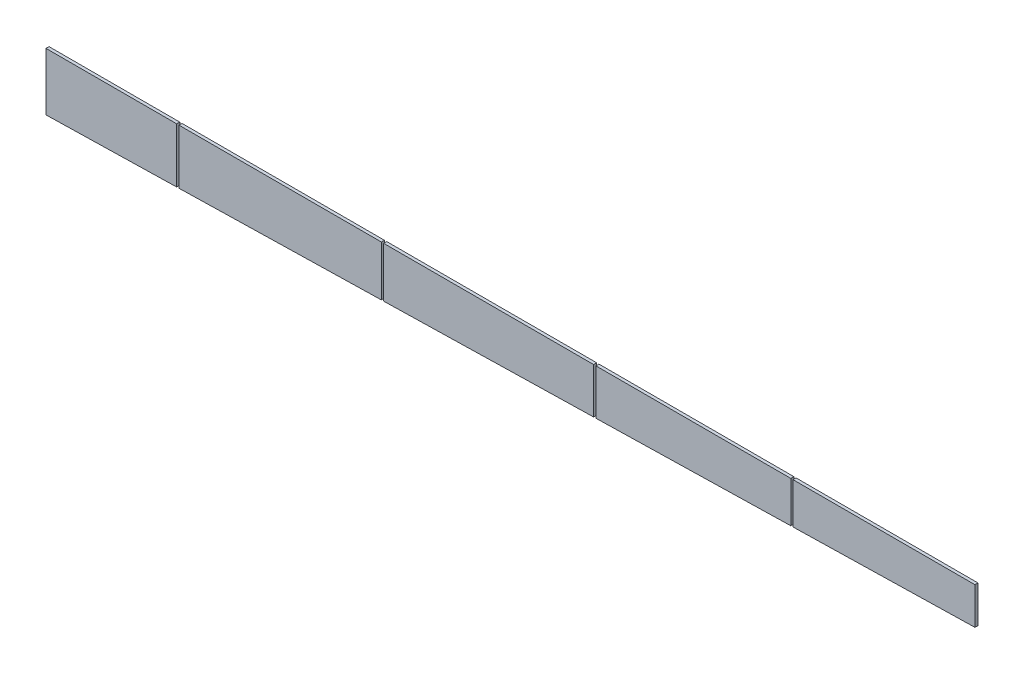
ISO-10303-21;
HEADER;
FILE_DESCRIPTION(('STEP AP214'),'2;1');
FILE_NAME('part.step','',(''),(''),'','','');
FILE_SCHEMA(('AUTOMOTIVE_DESIGN { 1 0 10303 214 1 1 1 1 }'));
ENDSEC;
DATA;
#1=APPLICATION_CONTEXT('core data for automotive mechanical design processes');
#2=APPLICATION_PROTOCOL_DEFINITION('international standard','automotive_design',2000,#1);
#3=PRODUCT_CONTEXT('',#1,'mechanical');
#4=PRODUCT('Part','Part','',(#3));
#5=PRODUCT_RELATED_PRODUCT_CATEGORY('part','',(#4));
#6=PRODUCT_DEFINITION_FORMATION('','',#4);
#7=PRODUCT_DEFINITION_CONTEXT('part definition',#1,'design');
#8=PRODUCT_DEFINITION('design','',#6,#7);
#9=PRODUCT_DEFINITION_SHAPE('','',#8);
#10=(LENGTH_UNIT() NAMED_UNIT(*) SI_UNIT(.MILLI.,.METRE.));
#11=(NAMED_UNIT(*) PLANE_ANGLE_UNIT() SI_UNIT($,.RADIAN.));
#12=(NAMED_UNIT(*) SI_UNIT($,.STERADIAN.) SOLID_ANGLE_UNIT());
#13=UNCERTAINTY_MEASURE_WITH_UNIT(LENGTH_MEASURE(1.E-05),#10,'distance_accuracy_value','');
#14=(GEOMETRIC_REPRESENTATION_CONTEXT(3) GLOBAL_UNCERTAINTY_ASSIGNED_CONTEXT((#13)) GLOBAL_UNIT_ASSIGNED_CONTEXT((#10,
#11,#12)) REPRESENTATION_CONTEXT('',''));
#15=CARTESIAN_POINT('',(0.,0.,0.));
#16=DIRECTION('',(0.,0.,1.));
#17=DIRECTION('',(1.,0.,0.));
#18=AXIS2_PLACEMENT_3D('',#15,#16,#17);
#19=CARTESIAN_POINT('',(621.768336890164,42.7521627669532,2.));
#20=DIRECTION('',(3.29392075161203E-09,-1.,0.));
#21=DIRECTION('',(1.,3.29392075161203E-09,0.));
#22=AXIS2_PLACEMENT_3D('',#19,#20,#21);
#23=PLANE('',#22);
#24=DIRECTION('',(-1.,-3.29392075161203E-09,0.));
#25=VECTOR('',#24,1.);
#26=CARTESIAN_POINT('',(621.768336890164,42.7521627669532,0.));
#27=LINE('',#26,#25);
#28=CARTESIAN_POINT('',(621.768336890164,42.7521627669532,0.));
#29=VERTEX_POINT('',#28);
#30=CARTESIAN_POINT('',(501.768336964029,42.7521623716827,0.));
#31=VERTEX_POINT('',#30);
#32=EDGE_CURVE('E12',#29,#31,#27,.T.);
#33=ORIENTED_EDGE('',*,*,#32,.T.);
#34=DIRECTION('',(0.,0.,-1.));
#35=VECTOR('',#34,1.);
#36=CARTESIAN_POINT('',(501.768336964029,42.7521623716827,2.));
#37=LINE('',#36,#35);
#38=CARTESIAN_POINT('',(501.768336964029,42.7521623716827,2.));
#39=VERTEX_POINT('',#38);
#40=EDGE_CURVE('E118',#39,#31,#37,.T.);
#41=ORIENTED_EDGE('',*,*,#40,.F.);
#42=DIRECTION('',(-1.,-3.29392075161203E-09,0.));
#43=VECTOR('',#42,1.);
#44=CARTESIAN_POINT('',(621.768336890164,42.7521627669532,2.));
#45=LINE('',#44,#43);
#46=CARTESIAN_POINT('',(621.768336890164,42.7521627669532,2.));
#47=VERTEX_POINT('',#46);
#48=EDGE_CURVE('E51',#47,#39,#45,.T.);
#49=ORIENTED_EDGE('',*,*,#48,.F.);
#50=DIRECTION('',(0.,0.,-1.));
#51=VECTOR('',#50,1.);
#52=CARTESIAN_POINT('',(621.768336890164,42.7521627669532,2.));
#53=LINE('',#52,#51);
#54=EDGE_CURVE('E106',#47,#29,#53,.T.);
#55=ORIENTED_EDGE('',*,*,#54,.T.);
#56=EDGE_LOOP('',(#33,#41,#49,#55));
#57=FACE_BOUND('',#56,.T.);
#58=ADVANCED_FACE('F47',(#57),#23,.F.);
#59=CARTESIAN_POINT('',(501.768336964029,42.7521623716827,2.));
#60=DIRECTION('',(1.,0.,0.));
#61=DIRECTION('',(0.,0.,-1.));
#62=AXIS2_PLACEMENT_3D('',#59,#60,#61);
#63=PLANE('',#62);
#64=DIRECTION('',(0.,-1.,0.));
#65=VECTOR('',#64,1.);
#66=CARTESIAN_POINT('',(501.768336964029,42.7521623716827,0.));
#67=LINE('',#66,#65);
#68=CARTESIAN_POINT('',(501.768336964029,15.6953244543433,0.));
#69=VERTEX_POINT('',#68);
#70=EDGE_CURVE('E57',#31,#69,#67,.T.);
#71=ORIENTED_EDGE('',*,*,#70,.T.);
#72=DIRECTION('',(0.,0.,-1.));
#73=VECTOR('',#72,1.);
#74=CARTESIAN_POINT('',(501.768336964029,15.6953244543433,2.));
#75=LINE('',#74,#73);
#76=CARTESIAN_POINT('',(501.768336964029,15.6953244543433,2.));
#77=VERTEX_POINT('',#76);
#78=EDGE_CURVE('E102',#77,#69,#75,.T.);
#79=ORIENTED_EDGE('',*,*,#78,.F.);
#80=DIRECTION('',(0.,-1.,0.));
#81=VECTOR('',#80,1.);
#82=CARTESIAN_POINT('',(501.768336964029,42.7521623716827,2.));
#83=LINE('',#82,#81);
#84=EDGE_CURVE('E81',#39,#77,#83,.T.);
#85=ORIENTED_EDGE('',*,*,#84,.F.);
#86=ORIENTED_EDGE('',*,*,#40,.T.);
#87=EDGE_LOOP('',(#71,#79,#85,#86));
#88=FACE_BOUND('',#87,.T.);
#89=ADVANCED_FACE('F121',(#88),#63,.F.);
#90=CARTESIAN_POINT('',(501.768336964029,15.6953244543433,2.));
#91=DIRECTION('',(-0.0222405963999348,0.99975264734422,0.));
#92=DIRECTION('',(-0.99975264734422,-0.0222405963999348,0.));
#93=AXIS2_PLACEMENT_3D('',#90,#91,#92);
#94=PLANE('',#93);
#95=DIRECTION('',(0.999752647344219,0.0222405963999348,0.));
#96=VECTOR('',#95,1.);
#97=CARTESIAN_POINT('',(501.768336964029,15.6953244543433,0.));
#98=LINE('',#97,#96);
#99=CARTESIAN_POINT('',(621.768336632832,18.3648563307688,0.));
#100=VERTEX_POINT('',#99);
#101=EDGE_CURVE('E97',#69,#100,#98,.T.);
#102=ORIENTED_EDGE('',*,*,#101,.T.);
#103=DIRECTION('',(0.,0.,-1.));
#104=VECTOR('',#103,1.);
#105=CARTESIAN_POINT('',(621.768336632832,18.3648563307688,2.));
#106=LINE('',#105,#104);
#107=CARTESIAN_POINT('',(621.768336632832,18.3648563307688,2.));
#108=VERTEX_POINT('',#107);
#109=EDGE_CURVE('E100',#108,#100,#106,.T.);
#110=ORIENTED_EDGE('',*,*,#109,.F.);
#111=DIRECTION('',(0.999752647344219,0.0222405963999348,0.));
#112=VECTOR('',#111,1.);
#113=CARTESIAN_POINT('',(501.768336964029,15.6953244543433,2.));
#114=LINE('',#113,#112);
#115=EDGE_CURVE('E114',#77,#108,#114,.T.);
#116=ORIENTED_EDGE('',*,*,#115,.F.);
#117=ORIENTED_EDGE('',*,*,#78,.T.);
#118=EDGE_LOOP('',(#102,#110,#116,#117));
#119=FACE_BOUND('',#118,.T.);
#120=ADVANCED_FACE('F98',(#119),#94,.F.);
#121=CARTESIAN_POINT('',(621.768336632832,18.3648563307688,2.));
#122=DIRECTION('',(-1.,1.05519028649025E-08,0.));
#123=DIRECTION('',(-1.05519028649025E-08,-1.,0.));
#124=AXIS2_PLACEMENT_3D('',#121,#122,#123);
#125=PLANE('',#124);
#126=DIRECTION('',(1.05519028649025E-08,1.,0.));
#127=VECTOR('',#126,1.);
#128=CARTESIAN_POINT('',(621.768336632832,18.3648563307688,0.));
#129=LINE('',#128,#127);
#130=EDGE_CURVE('E91',#100,#29,#129,.T.);
#131=ORIENTED_EDGE('',*,*,#130,.T.);
#132=ORIENTED_EDGE('',*,*,#54,.F.);
#133=DIRECTION('',(1.05519028649025E-08,1.,0.));
#134=VECTOR('',#133,1.);
#135=CARTESIAN_POINT('',(621.768336632832,18.3648563307688,2.));
#136=LINE('',#135,#134);
#137=EDGE_CURVE('E105',#108,#47,#136,.T.);
#138=ORIENTED_EDGE('',*,*,#137,.F.);
#139=ORIENTED_EDGE('',*,*,#109,.T.);
#140=EDGE_LOOP('',(#131,#132,#138,#139));
#141=FACE_BOUND('',#140,.T.);
#142=ADVANCED_FACE('F104',(#141),#125,.F.);
#143=CARTESIAN_POINT('',(0.,0.,2.));
#144=DIRECTION('',(0.,0.,1.));
#145=DIRECTION('',(1.,0.,0.));
#146=AXIS2_PLACEMENT_3D('',#143,#144,#145);
#147=PLANE('',#146);
#148=ORIENTED_EDGE('',*,*,#48,.T.);
#149=ORIENTED_EDGE('',*,*,#84,.T.);
#150=ORIENTED_EDGE('',*,*,#115,.T.);
#151=ORIENTED_EDGE('',*,*,#137,.T.);
#152=EDGE_LOOP('',(#148,#149,#150,#151));
#153=FACE_BOUND('',#152,.T.);
#154=ADVANCED_FACE('F49',(#153),#147,.T.);
#155=CARTESIAN_POINT('',(0.,0.,0.));
#156=DIRECTION('',(0.,0.,1.));
#157=DIRECTION('',(1.,0.,0.));
#158=AXIS2_PLACEMENT_3D('',#155,#156,#157);
#159=PLANE('',#158);
#160=ORIENTED_EDGE('',*,*,#32,.F.);
#161=ORIENTED_EDGE('',*,*,#130,.F.);
#162=ORIENTED_EDGE('',*,*,#101,.F.);
#163=ORIENTED_EDGE('',*,*,#70,.F.);
#164=EDGE_LOOP('',(#160,#161,#162,#163));
#165=FACE_BOUND('',#164,.T.);
#166=ADVANCED_FACE('F108',(#165),#159,.F.);
#167=CLOSED_SHELL('',(#58,#89,#120,#142,#154,#166));
#168=MANIFOLD_SOLID_BREP('B2',#167);
#169=CARTESIAN_POINT('',(500.268336964029,42.7521623667417,2.));
#170=DIRECTION('',(3.2939208537579E-09,-1.,0.));
#171=DIRECTION('',(1.,3.2939208537579E-09,0.));
#172=AXIS2_PLACEMENT_3D('',#169,#170,#171);
#173=PLANE('',#172);
#174=DIRECTION('',(-1.,-3.2939208537579E-09,0.));
#175=VECTOR('',#174,1.);
#176=CARTESIAN_POINT('',(500.268336964029,42.7521623667417,0.));
#177=LINE('',#176,#175);
#178=CARTESIAN_POINT('',(500.268336964029,42.7521623667417,0.));
#179=VERTEX_POINT('',#178);
#180=CARTESIAN_POINT('',(371.768336964029,42.7521619434729,0.));
#181=VERTEX_POINT('',#180);
#182=EDGE_CURVE('E45',#179,#181,#177,.T.);
#183=ORIENTED_EDGE('',*,*,#182,.T.);
#184=DIRECTION('',(0.,0.,-1.));
#185=VECTOR('',#184,1.);
#186=CARTESIAN_POINT('',(371.768336964029,42.7521619434729,2.));
#187=LINE('',#186,#185);
#188=CARTESIAN_POINT('',(371.768336964029,42.7521619434729,2.));
#189=VERTEX_POINT('',#188);
#190=EDGE_CURVE('E263',#189,#181,#187,.T.);
#191=ORIENTED_EDGE('',*,*,#190,.F.);
#192=DIRECTION('',(-1.,-3.2939208537579E-09,0.));
#193=VECTOR('',#192,1.);
#194=CARTESIAN_POINT('',(500.268336964029,42.7521623667417,2.));
#195=LINE('',#194,#193);
#196=CARTESIAN_POINT('',(500.268336964029,42.7521623667417,2.));
#197=VERTEX_POINT('',#196);
#198=EDGE_CURVE('E196',#197,#189,#195,.T.);
#199=ORIENTED_EDGE('',*,*,#198,.F.);
#200=DIRECTION('',(0.,0.,-1.));
#201=VECTOR('',#200,1.);
#202=CARTESIAN_POINT('',(500.268336964029,42.7521623667417,2.));
#203=LINE('',#202,#201);
#204=EDGE_CURVE('E251',#197,#179,#203,.T.);
#205=ORIENTED_EDGE('',*,*,#204,.T.);
#206=EDGE_LOOP('',(#183,#191,#199,#205));
#207=FACE_BOUND('',#206,.T.);
#208=ADVANCED_FACE('F192',(#207),#173,.F.);
#209=CARTESIAN_POINT('',(371.768336964029,42.7521619434729,2.));
#210=DIRECTION('',(1.,0.,0.));
#211=DIRECTION('',(0.,0.,-1.));
#212=AXIS2_PLACEMENT_3D('',#209,#210,#211);
#213=PLANE('',#212);
#214=DIRECTION('',(0.,-1.,0.));
#215=VECTOR('',#214,1.);
#216=CARTESIAN_POINT('',(371.768336964029,42.7521619434729,0.));
#217=LINE('',#216,#215);
#218=CARTESIAN_POINT('',(371.768336964029,12.8033315802338,0.));
#219=VERTEX_POINT('',#218);
#220=EDGE_CURVE('E202',#181,#219,#217,.T.);
#221=ORIENTED_EDGE('',*,*,#220,.T.);
#222=DIRECTION('',(0.,0.,-1.));
#223=VECTOR('',#222,1.);
#224=CARTESIAN_POINT('',(371.768336964029,12.8033315802338,2.));
#225=LINE('',#224,#223);
#226=CARTESIAN_POINT('',(371.768336964029,12.8033315802338,2.));
#227=VERTEX_POINT('',#226);
#228=EDGE_CURVE('E247',#227,#219,#225,.T.);
#229=ORIENTED_EDGE('',*,*,#228,.F.);
#230=DIRECTION('',(0.,-1.,0.));
#231=VECTOR('',#230,1.);
#232=CARTESIAN_POINT('',(371.768336964029,42.7521619434729,2.));
#233=LINE('',#232,#231);
#234=EDGE_CURVE('E226',#189,#227,#233,.T.);
#235=ORIENTED_EDGE('',*,*,#234,.F.);
#236=ORIENTED_EDGE('',*,*,#190,.T.);
#237=EDGE_LOOP('',(#221,#229,#235,#236));
#238=FACE_BOUND('',#237,.T.);
#239=ADVANCED_FACE('F266',(#238),#213,.F.);
#240=CARTESIAN_POINT('',(371.768336964029,12.8033315802338,2.));
#241=DIRECTION('',(-0.0222405963999345,0.99975264734422,0.));
#242=DIRECTION('',(-0.99975264734422,-0.0222405963999345,0.));
#243=AXIS2_PLACEMENT_3D('',#240,#241,#242);
#244=PLANE('',#243);
#245=DIRECTION('',(0.999752647344219,0.0222405963999345,0.));
#246=VECTOR('',#245,1.);
#247=CARTESIAN_POINT('',(371.768336964029,12.8033315802338,0.));
#248=LINE('',#247,#246);
#249=CARTESIAN_POINT('',(500.268336964029,15.6619553057958,0.));
#250=VERTEX_POINT('',#249);
#251=EDGE_CURVE('E242',#219,#250,#248,.T.);
#252=ORIENTED_EDGE('',*,*,#251,.T.);
#253=DIRECTION('',(0.,0.,-1.));
#254=VECTOR('',#253,1.);
#255=CARTESIAN_POINT('',(500.268336964029,15.6619553057958,2.));
#256=LINE('',#255,#254);
#257=CARTESIAN_POINT('',(500.268336964029,15.6619553057958,2.));
#258=VERTEX_POINT('',#257);
#259=EDGE_CURVE('E245',#258,#250,#256,.T.);
#260=ORIENTED_EDGE('',*,*,#259,.F.);
#261=DIRECTION('',(0.999752647344219,0.0222405963999345,0.));
#262=VECTOR('',#261,1.);
#263=CARTESIAN_POINT('',(371.768336964029,12.8033315802338,2.));
#264=LINE('',#263,#262);
#265=EDGE_CURVE('E259',#227,#258,#264,.T.);
#266=ORIENTED_EDGE('',*,*,#265,.F.);
#267=ORIENTED_EDGE('',*,*,#228,.T.);
#268=EDGE_LOOP('',(#252,#260,#266,#267));
#269=FACE_BOUND('',#268,.T.);
#270=ADVANCED_FACE('F243',(#269),#244,.F.);
#271=CARTESIAN_POINT('',(500.268336964029,15.6619553057958,2.));
#272=DIRECTION('',(-1.,0.,0.));
#273=DIRECTION('',(0.,0.,1.));
#274=AXIS2_PLACEMENT_3D('',#271,#272,#273);
#275=PLANE('',#274);
#276=DIRECTION('',(0.,1.,0.));
#277=VECTOR('',#276,1.);
#278=CARTESIAN_POINT('',(500.268336964029,15.6619553057958,0.));
#279=LINE('',#278,#277);
#280=EDGE_CURVE('E236',#250,#179,#279,.T.);
#281=ORIENTED_EDGE('',*,*,#280,.T.);
#282=ORIENTED_EDGE('',*,*,#204,.F.);
#283=DIRECTION('',(0.,1.,0.));
#284=VECTOR('',#283,1.);
#285=CARTESIAN_POINT('',(500.268336964029,15.6619553057958,2.));
#286=LINE('',#285,#284);
#287=EDGE_CURVE('E250',#258,#197,#286,.T.);
#288=ORIENTED_EDGE('',*,*,#287,.F.);
#289=ORIENTED_EDGE('',*,*,#259,.T.);
#290=EDGE_LOOP('',(#281,#282,#288,#289));
#291=FACE_BOUND('',#290,.T.);
#292=ADVANCED_FACE('F249',(#291),#275,.F.);
#293=CARTESIAN_POINT('',(0.,0.,2.));
#294=DIRECTION('',(0.,0.,1.));
#295=DIRECTION('',(1.,0.,0.));
#296=AXIS2_PLACEMENT_3D('',#293,#294,#295);
#297=PLANE('',#296);
#298=ORIENTED_EDGE('',*,*,#198,.T.);
#299=ORIENTED_EDGE('',*,*,#234,.T.);
#300=ORIENTED_EDGE('',*,*,#265,.T.);
#301=ORIENTED_EDGE('',*,*,#287,.T.);
#302=EDGE_LOOP('',(#298,#299,#300,#301));
#303=FACE_BOUND('',#302,.T.);
#304=ADVANCED_FACE('F194',(#303),#297,.T.);
#305=CARTESIAN_POINT('',(0.,0.,0.));
#306=DIRECTION('',(0.,0.,1.));
#307=DIRECTION('',(1.,0.,0.));
#308=AXIS2_PLACEMENT_3D('',#305,#306,#307);
#309=PLANE('',#308);
#310=ORIENTED_EDGE('',*,*,#182,.F.);
#311=ORIENTED_EDGE('',*,*,#280,.F.);
#312=ORIENTED_EDGE('',*,*,#251,.F.);
#313=ORIENTED_EDGE('',*,*,#220,.F.);
#314=EDGE_LOOP('',(#310,#311,#312,#313));
#315=FACE_BOUND('',#314,.T.);
#316=ADVANCED_FACE('F253',(#315),#309,.F.);
#317=CLOSED_SHELL('',(#208,#239,#270,#292,#304,#316));
#318=MANIFOLD_SOLID_BREP('B6',#317);
#319=CARTESIAN_POINT('',(231.768336964029,9.68887771580808,2.));
#320=DIRECTION('',(1.,0.,0.));
#321=DIRECTION('',(0.,0.,-1.));
#322=AXIS2_PLACEMENT_3D('',#319,#320,#321);
#323=PLANE('',#322);
#324=DIRECTION('',(0.,-1.,0.));
#325=VECTOR('',#324,1.);
#326=CARTESIAN_POINT('',(231.768336964029,9.68887771580808,0.));
#327=LINE('',#326,#325);
#328=CARTESIAN_POINT('',(231.768336964029,42.752161482324,0.));
#329=VERTEX_POINT('',#328);
#330=CARTESIAN_POINT('',(231.768336964029,9.68887771580808,0.));
#331=VERTEX_POINT('',#330);
#332=EDGE_CURVE('E190',#329,#331,#327,.T.);
#333=ORIENTED_EDGE('',*,*,#332,.T.);
#334=DIRECTION('',(0.,0.,-1.));
#335=VECTOR('',#334,1.);
#336=CARTESIAN_POINT('',(231.768336964029,9.68887771580808,2.));
#337=LINE('',#336,#335);
#338=CARTESIAN_POINT('',(231.768336964029,9.68887771580808,2.));
#339=VERTEX_POINT('',#338);
#340=EDGE_CURVE('E408',#339,#331,#337,.T.);
#341=ORIENTED_EDGE('',*,*,#340,.F.);
#342=DIRECTION('',(0.,-1.,0.));
#343=VECTOR('',#342,1.);
#344=CARTESIAN_POINT('',(231.768336964029,9.68887771580808,2.));
#345=LINE('',#344,#343);
#346=CARTESIAN_POINT('',(231.768336964029,42.752161482324,2.));
#347=VERTEX_POINT('',#346);
#348=EDGE_CURVE('E341',#347,#339,#345,.T.);
#349=ORIENTED_EDGE('',*,*,#348,.F.);
#350=DIRECTION('',(0.,0.,-1.));
#351=VECTOR('',#350,1.);
#352=CARTESIAN_POINT('',(231.768336964029,42.752161482324,2.));
#353=LINE('',#352,#351);
#354=EDGE_CURVE('E396',#347,#329,#353,.T.);
#355=ORIENTED_EDGE('',*,*,#354,.T.);
#356=EDGE_LOOP('',(#333,#341,#349,#355));
#357=FACE_BOUND('',#356,.T.);
#358=ADVANCED_FACE('F337',(#357),#323,.F.);
#359=CARTESIAN_POINT('',(370.268336964029,12.7699624316863,2.));
#360=DIRECTION('',(-0.0222405963999354,0.99975264734422,0.));
#361=DIRECTION('',(-0.99975264734422,-0.0222405963999354,0.));
#362=AXIS2_PLACEMENT_3D('',#359,#360,#361);
#363=PLANE('',#362);
#364=DIRECTION('',(0.999752647344219,0.0222405963999354,0.));
#365=VECTOR('',#364,1.);
#366=CARTESIAN_POINT('',(370.268336964029,12.7699624316863,0.));
#367=LINE('',#366,#365);
#368=CARTESIAN_POINT('',(370.268336964029,12.7699624316863,0.));
#369=VERTEX_POINT('',#368);
#370=EDGE_CURVE('E347',#331,#369,#367,.T.);
#371=ORIENTED_EDGE('',*,*,#370,.T.);
#372=DIRECTION('',(0.,0.,-1.));
#373=VECTOR('',#372,1.);
#374=CARTESIAN_POINT('',(370.268336964029,12.7699624316863,2.));
#375=LINE('',#374,#373);
#376=CARTESIAN_POINT('',(370.268336964029,12.7699624316863,2.));
#377=VERTEX_POINT('',#376);
#378=EDGE_CURVE('E392',#377,#369,#375,.T.);
#379=ORIENTED_EDGE('',*,*,#378,.F.);
#380=DIRECTION('',(0.999752647344219,0.0222405963999354,0.));
#381=VECTOR('',#380,1.);
#382=CARTESIAN_POINT('',(370.268336964029,12.7699624316863,2.));
#383=LINE('',#382,#381);
#384=EDGE_CURVE('E371',#339,#377,#383,.T.);
#385=ORIENTED_EDGE('',*,*,#384,.F.);
#386=ORIENTED_EDGE('',*,*,#340,.T.);
#387=EDGE_LOOP('',(#371,#379,#385,#386));
#388=FACE_BOUND('',#387,.T.);
#389=ADVANCED_FACE('F411',(#388),#363,.F.);
#390=CARTESIAN_POINT('',(370.268336964029,42.752161938532,2.));
#391=DIRECTION('',(-1.,0.,0.));
#392=DIRECTION('',(0.,0.,1.));
#393=AXIS2_PLACEMENT_3D('',#390,#391,#392);
#394=PLANE('',#393);
#395=DIRECTION('',(0.,1.,0.));
#396=VECTOR('',#395,1.);
#397=CARTESIAN_POINT('',(370.268336964029,42.752161938532,0.));
#398=LINE('',#397,#396);
#399=CARTESIAN_POINT('',(370.268336964029,42.752161938532,0.));
#400=VERTEX_POINT('',#399);
#401=EDGE_CURVE('E387',#369,#400,#398,.T.);
#402=ORIENTED_EDGE('',*,*,#401,.T.);
#403=DIRECTION('',(0.,0.,-1.));
#404=VECTOR('',#403,1.);
#405=CARTESIAN_POINT('',(370.268336964029,42.752161938532,2.));
#406=LINE('',#405,#404);
#407=CARTESIAN_POINT('',(370.268336964029,42.752161938532,2.));
#408=VERTEX_POINT('',#407);
#409=EDGE_CURVE('E390',#408,#400,#406,.T.);
#410=ORIENTED_EDGE('',*,*,#409,.F.);
#411=DIRECTION('',(0.,1.,0.));
#412=VECTOR('',#411,1.);
#413=CARTESIAN_POINT('',(370.268336964029,42.752161938532,2.));
#414=LINE('',#413,#412);
#415=EDGE_CURVE('E404',#377,#408,#414,.T.);
#416=ORIENTED_EDGE('',*,*,#415,.F.);
#417=ORIENTED_EDGE('',*,*,#378,.T.);
#418=EDGE_LOOP('',(#402,#410,#416,#417));
#419=FACE_BOUND('',#418,.T.);
#420=ADVANCED_FACE('F388',(#419),#394,.F.);
#421=CARTESIAN_POINT('',(231.768336964029,42.752161482324,2.));
#422=DIRECTION('',(3.29392059155974E-09,-1.,0.));
#423=DIRECTION('',(1.,3.29392059155974E-09,0.));
#424=AXIS2_PLACEMENT_3D('',#421,#422,#423);
#425=PLANE('',#424);
#426=DIRECTION('',(-1.,-3.29392059155974E-09,0.));
#427=VECTOR('',#426,1.);
#428=CARTESIAN_POINT('',(231.768336964029,42.752161482324,0.));
#429=LINE('',#428,#427);
#430=EDGE_CURVE('E381',#400,#329,#429,.T.);
#431=ORIENTED_EDGE('',*,*,#430,.T.);
#432=ORIENTED_EDGE('',*,*,#354,.F.);
#433=DIRECTION('',(-1.,-3.29392059155974E-09,0.));
#434=VECTOR('',#433,1.);
#435=CARTESIAN_POINT('',(231.768336964029,42.752161482324,2.));
#436=LINE('',#435,#434);
#437=EDGE_CURVE('E395',#408,#347,#436,.T.);
#438=ORIENTED_EDGE('',*,*,#437,.F.);
#439=ORIENTED_EDGE('',*,*,#409,.T.);
#440=EDGE_LOOP('',(#431,#432,#438,#439));
#441=FACE_BOUND('',#440,.T.);
#442=ADVANCED_FACE('F394',(#441),#425,.F.);
#443=CARTESIAN_POINT('',(0.,0.,2.));
#444=DIRECTION('',(0.,0.,-1.));
#445=DIRECTION('',(-1.,0.,0.));
#446=AXIS2_PLACEMENT_3D('',#443,#444,#445);
#447=PLANE('',#446);
#448=ORIENTED_EDGE('',*,*,#348,.T.);
#449=ORIENTED_EDGE('',*,*,#384,.T.);
#450=ORIENTED_EDGE('',*,*,#415,.T.);
#451=ORIENTED_EDGE('',*,*,#437,.T.);
#452=EDGE_LOOP('',(#448,#449,#450,#451));
#453=FACE_BOUND('',#452,.T.);
#454=ADVANCED_FACE('F339',(#453),#447,.F.);
#455=CARTESIAN_POINT('',(0.,0.,0.));
#456=DIRECTION('',(0.,0.,-1.));
#457=DIRECTION('',(-1.,0.,0.));
#458=AXIS2_PLACEMENT_3D('',#455,#456,#457);
#459=PLANE('',#458);
#460=ORIENTED_EDGE('',*,*,#332,.F.);
#461=ORIENTED_EDGE('',*,*,#430,.F.);
#462=ORIENTED_EDGE('',*,*,#401,.F.);
#463=ORIENTED_EDGE('',*,*,#370,.F.);
#464=EDGE_LOOP('',(#460,#461,#462,#463));
#465=FACE_BOUND('',#464,.T.);
#466=ADVANCED_FACE('F398',(#465),#459,.T.);
#467=CLOSED_SHELL('',(#358,#389,#420,#442,#454,#466));
#468=MANIFOLD_SOLID_BREP('B39',#467);
#469=CARTESIAN_POINT('',(230.268336964029,42.7521614773832,2.));
#470=DIRECTION('',(3.29392240699258E-09,-1.,0.));
#471=DIRECTION('',(1.,3.29392240699258E-09,0.));
#472=AXIS2_PLACEMENT_3D('',#469,#470,#471);
#473=PLANE('',#472);
#474=DIRECTION('',(-1.,-3.29392240699258E-09,0.));
#475=VECTOR('',#474,1.);
#476=CARTESIAN_POINT('',(230.268336964029,42.7521614773832,0.));
#477=LINE('',#476,#475);
#478=CARTESIAN_POINT('',(230.268336964029,42.7521614773832,0.));
#479=VERTEX_POINT('',#478);
#480=CARTESIAN_POINT('',(96.768336964029,42.7521610376446,0.));
#481=VERTEX_POINT('',#480);
#482=EDGE_CURVE('E335',#479,#481,#477,.T.);
#483=ORIENTED_EDGE('',*,*,#482,.T.);
#484=DIRECTION('',(0.,0.,-1.));
#485=VECTOR('',#484,1.);
#486=CARTESIAN_POINT('',(96.768336964029,42.7521610376446,2.));
#487=LINE('',#486,#485);
#488=CARTESIAN_POINT('',(96.768336964029,42.7521610376446,2.));
#489=VERTEX_POINT('',#488);
#490=EDGE_CURVE('E552',#489,#481,#487,.T.);
#491=ORIENTED_EDGE('',*,*,#490,.F.);
#492=DIRECTION('',(-1.,-3.29392240699258E-09,0.));
#493=VECTOR('',#492,1.);
#494=CARTESIAN_POINT('',(230.268336964029,42.7521614773832,2.));
#495=LINE('',#494,#493);
#496=CARTESIAN_POINT('',(230.268336964029,42.7521614773832,2.));
#497=VERTEX_POINT('',#496);
#498=EDGE_CURVE('E485',#497,#489,#495,.T.);
#499=ORIENTED_EDGE('',*,*,#498,.F.);
#500=DIRECTION('',(0.,0.,-1.));
#501=VECTOR('',#500,1.);
#502=CARTESIAN_POINT('',(230.268336964029,42.7521614773832,2.));
#503=LINE('',#502,#501);
#504=EDGE_CURVE('E540',#497,#479,#503,.T.);
#505=ORIENTED_EDGE('',*,*,#504,.T.);
#506=EDGE_LOOP('',(#483,#491,#499,#505));
#507=FACE_BOUND('',#506,.T.);
#508=ADVANCED_FACE('F481',(#507),#473,.F.);
#509=CARTESIAN_POINT('',(96.768336964029,42.7521610376446,2.));
#510=DIRECTION('',(1.,0.,0.));
#511=DIRECTION('',(0.,0.,-1.));
#512=AXIS2_PLACEMENT_3D('',#509,#510,#511);
#513=PLANE('',#512);
#514=DIRECTION('',(0.,-1.,0.));
#515=VECTOR('',#514,1.);
#516=CARTESIAN_POINT('',(96.768336964029,42.7521610376446,0.));
#517=LINE('',#516,#515);
#518=CARTESIAN_POINT('',(96.768336964029,6.68565434654056,0.));
#519=VERTEX_POINT('',#518);
#520=EDGE_CURVE('E491',#481,#519,#517,.T.);
#521=ORIENTED_EDGE('',*,*,#520,.T.);
#522=DIRECTION('',(0.,0.,-1.));
#523=VECTOR('',#522,1.);
#524=CARTESIAN_POINT('',(96.768336964029,6.68565434654056,2.));
#525=LINE('',#524,#523);
#526=CARTESIAN_POINT('',(96.768336964029,6.68565434654056,2.));
#527=VERTEX_POINT('',#526);
#528=EDGE_CURVE('E536',#527,#519,#525,.T.);
#529=ORIENTED_EDGE('',*,*,#528,.F.);
#530=DIRECTION('',(0.,-1.,0.));
#531=VECTOR('',#530,1.);
#532=CARTESIAN_POINT('',(96.768336964029,42.7521610376446,2.));
#533=LINE('',#532,#531);
#534=EDGE_CURVE('E515',#489,#527,#533,.T.);
#535=ORIENTED_EDGE('',*,*,#534,.F.);
#536=ORIENTED_EDGE('',*,*,#490,.T.);
#537=EDGE_LOOP('',(#521,#529,#535,#536));
#538=FACE_BOUND('',#537,.T.);
#539=ADVANCED_FACE('F555',(#538),#513,.F.);
#540=CARTESIAN_POINT('',(96.768336964029,6.68565434654056,2.));
#541=DIRECTION('',(-0.0222405963999358,0.99975264734422,0.));
#542=DIRECTION('',(-0.99975264734422,-0.0222405963999358,0.));
#543=AXIS2_PLACEMENT_3D('',#540,#541,#542);
#544=PLANE('',#543);
#545=DIRECTION('',(0.999752647344219,0.0222405963999358,0.));
#546=VECTOR('',#545,1.);
#547=CARTESIAN_POINT('',(96.768336964029,6.68565434654056,0.));
#548=LINE('',#547,#546);
#549=CARTESIAN_POINT('',(230.268336964029,9.65550856726077,0.));
#550=VERTEX_POINT('',#549);
#551=EDGE_CURVE('E531',#519,#550,#548,.T.);
#552=ORIENTED_EDGE('',*,*,#551,.T.);
#553=DIRECTION('',(0.,0.,-1.));
#554=VECTOR('',#553,1.);
#555=CARTESIAN_POINT('',(230.268336964029,9.65550856726077,2.));
#556=LINE('',#555,#554);
#557=CARTESIAN_POINT('',(230.268336964029,9.65550856726077,2.));
#558=VERTEX_POINT('',#557);
#559=EDGE_CURVE('E534',#558,#550,#556,.T.);
#560=ORIENTED_EDGE('',*,*,#559,.F.);
#561=DIRECTION('',(0.999752647344219,0.0222405963999358,0.));
#562=VECTOR('',#561,1.);
#563=CARTESIAN_POINT('',(96.768336964029,6.68565434654056,2.));
#564=LINE('',#563,#562);
#565=EDGE_CURVE('E548',#527,#558,#564,.T.);
#566=ORIENTED_EDGE('',*,*,#565,.F.);
#567=ORIENTED_EDGE('',*,*,#528,.T.);
#568=EDGE_LOOP('',(#552,#560,#566,#567));
#569=FACE_BOUND('',#568,.T.);
#570=ADVANCED_FACE('F532',(#569),#544,.F.);
#571=CARTESIAN_POINT('',(230.268336964029,9.65550856726077,2.));
#572=DIRECTION('',(-1.,0.,0.));
#573=DIRECTION('',(0.,0.,1.));
#574=AXIS2_PLACEMENT_3D('',#571,#572,#573);
#575=PLANE('',#574);
#576=DIRECTION('',(0.,1.,0.));
#577=VECTOR('',#576,1.);
#578=CARTESIAN_POINT('',(230.268336964029,9.65550856726077,0.));
#579=LINE('',#578,#577);
#580=EDGE_CURVE('E525',#550,#479,#579,.T.);
#581=ORIENTED_EDGE('',*,*,#580,.T.);
#582=ORIENTED_EDGE('',*,*,#504,.F.);
#583=DIRECTION('',(0.,1.,0.));
#584=VECTOR('',#583,1.);
#585=CARTESIAN_POINT('',(230.268336964029,9.65550856726077,2.));
#586=LINE('',#585,#584);
#587=EDGE_CURVE('E539',#558,#497,#586,.T.);
#588=ORIENTED_EDGE('',*,*,#587,.F.);
#589=ORIENTED_EDGE('',*,*,#559,.T.);
#590=EDGE_LOOP('',(#581,#582,#588,#589));
#591=FACE_BOUND('',#590,.T.);
#592=ADVANCED_FACE('F538',(#591),#575,.F.);
#593=CARTESIAN_POINT('',(0.,0.,2.));
#594=DIRECTION('',(0.,0.,1.));
#595=DIRECTION('',(1.,0.,0.));
#596=AXIS2_PLACEMENT_3D('',#593,#594,#595);
#597=PLANE('',#596);
#598=ORIENTED_EDGE('',*,*,#498,.T.);
#599=ORIENTED_EDGE('',*,*,#534,.T.);
#600=ORIENTED_EDGE('',*,*,#565,.T.);
#601=ORIENTED_EDGE('',*,*,#587,.T.);
#602=EDGE_LOOP('',(#598,#599,#600,#601));
#603=FACE_BOUND('',#602,.T.);
#604=ADVANCED_FACE('F483',(#603),#597,.T.);
#605=CARTESIAN_POINT('',(0.,0.,0.));
#606=DIRECTION('',(0.,0.,1.));
#607=DIRECTION('',(1.,0.,0.));
#608=AXIS2_PLACEMENT_3D('',#605,#606,#607);
#609=PLANE('',#608);
#610=ORIENTED_EDGE('',*,*,#482,.F.);
#611=ORIENTED_EDGE('',*,*,#580,.F.);
#612=ORIENTED_EDGE('',*,*,#551,.F.);
#613=ORIENTED_EDGE('',*,*,#520,.F.);
#614=EDGE_LOOP('',(#610,#611,#612,#613));
#615=FACE_BOUND('',#614,.T.);
#616=ADVANCED_FACE('F542',(#615),#609,.F.);
#617=CLOSED_SHELL('',(#508,#539,#570,#592,#604,#616));
#618=MANIFOLD_SOLID_BREP('B184',#617);
#619=CARTESIAN_POINT('',(95.268336964029,42.7521610327037,2.));
#620=DIRECTION('',(3.29392141666748E-09,-1.,0.));
#621=DIRECTION('',(1.,3.29392141666748E-09,0.));
#622=AXIS2_PLACEMENT_3D('',#619,#620,#621);
#623=PLANE('',#622);
#624=DIRECTION('',(-1.,-3.29392141666748E-09,0.));
#625=VECTOR('',#624,1.);
#626=CARTESIAN_POINT('',(95.268336964029,42.7521610327037,0.));
#627=LINE('',#626,#625);
#628=CARTESIAN_POINT('',(95.268336964029,42.7521610327037,0.));
#629=VERTEX_POINT('',#628);
#630=CARTESIAN_POINT('',(9.04299234500832,42.7521607486842,0.));
#631=VERTEX_POINT('',#630);
#632=EDGE_CURVE('E679',#629,#631,#627,.T.);
#633=ORIENTED_EDGE('',*,*,#632,.T.);
#634=DIRECTION('',(0.,0.,-1.));
#635=VECTOR('',#634,1.);
#636=CARTESIAN_POINT('',(9.04299234500832,42.7521607486842,2.));
#637=LINE('',#636,#635);
#638=CARTESIAN_POINT('',(9.04299234500832,42.7521607486842,2.));
#639=VERTEX_POINT('',#638);
#640=EDGE_CURVE('E479',#639,#631,#637,.T.);
#641=ORIENTED_EDGE('',*,*,#640,.F.);
#642=DIRECTION('',(-1.,-3.29392141666748E-09,0.));
#643=VECTOR('',#642,1.);
#644=CARTESIAN_POINT('',(95.268336964029,42.7521610327037,2.));
#645=LINE('',#644,#643);
#646=CARTESIAN_POINT('',(95.268336964029,42.7521610327037,2.));
#647=VERTEX_POINT('',#646);
#648=EDGE_CURVE('E667',#647,#639,#645,.T.);
#649=ORIENTED_EDGE('',*,*,#648,.F.);
#650=DIRECTION('',(0.,0.,-1.));
#651=VECTOR('',#650,1.);
#652=CARTESIAN_POINT('',(95.268336964029,42.7521610327037,2.));
#653=LINE('',#652,#651);
#654=EDGE_CURVE('E675',#647,#629,#653,.T.);
#655=ORIENTED_EDGE('',*,*,#654,.T.);
#656=EDGE_LOOP('',(#633,#641,#649,#655));
#657=FACE_BOUND('',#656,.T.);
#658=ADVANCED_FACE('F616',(#657),#623,.F.);
#659=CARTESIAN_POINT('',(9.04299234500832,42.7521607486842,2.));
#660=DIRECTION('',(1.,0.,0.));
#661=DIRECTION('',(0.,0.,-1.));
#662=AXIS2_PLACEMENT_3D('',#659,#660,#661);
#663=PLANE('',#662);
#664=DIRECTION('',(0.,-1.,0.));
#665=VECTOR('',#664,1.);
#666=CARTESIAN_POINT('',(9.04299234500832,42.7521607486842,0.));
#667=LINE('',#666,#665);
#668=CARTESIAN_POINT('',(9.04299234500832,4.73410764256369,0.));
#669=VERTEX_POINT('',#668);
#670=EDGE_CURVE('E671',#631,#669,#667,.T.);
#671=ORIENTED_EDGE('',*,*,#670,.T.);
#672=DIRECTION('',(0.,0.,-1.));
#673=VECTOR('',#672,1.);
#674=CARTESIAN_POINT('',(9.04299234500832,4.73410764256369,2.));
#675=LINE('',#674,#673);
#676=CARTESIAN_POINT('',(9.04299234500832,4.73410764256369,2.));
#677=VERTEX_POINT('',#676);
#678=EDGE_CURVE('E624',#677,#669,#675,.T.);
#679=ORIENTED_EDGE('',*,*,#678,.F.);
#680=DIRECTION('',(0.,-1.,0.));
#681=VECTOR('',#680,1.);
#682=CARTESIAN_POINT('',(9.04299234500832,42.7521607486842,2.));
#683=LINE('',#682,#681);
#684=EDGE_CURVE('E662',#639,#677,#683,.T.);
#685=ORIENTED_EDGE('',*,*,#684,.F.);
#686=ORIENTED_EDGE('',*,*,#640,.T.);
#687=EDGE_LOOP('',(#671,#679,#685,#686));
#688=FACE_BOUND('',#687,.T.);
#689=ADVANCED_FACE('F670',(#688),#663,.F.);
#690=CARTESIAN_POINT('',(9.04299234500832,4.73410764256369,2.));
#691=DIRECTION('',(-0.0222405963999353,0.99975264734422,0.));
#692=DIRECTION('',(-0.99975264734422,-0.0222405963999353,0.));
#693=AXIS2_PLACEMENT_3D('',#690,#691,#692);
#694=PLANE('',#693);
#695=DIRECTION('',(0.999752647344219,0.0222405963999353,0.));
#696=VECTOR('',#695,1.);
#697=CARTESIAN_POINT('',(9.04299234500832,4.73410764256369,0.));
#698=LINE('',#697,#696);
#699=CARTESIAN_POINT('',(95.268336964029,6.65228519799325,0.));
#700=VERTEX_POINT('',#699);
#701=EDGE_CURVE('E649',#669,#700,#698,.T.);
#702=ORIENTED_EDGE('',*,*,#701,.T.);
#703=DIRECTION('',(0.,0.,-1.));
#704=VECTOR('',#703,1.);
#705=CARTESIAN_POINT('',(95.268336964029,6.65228519799325,2.));
#706=LINE('',#705,#704);
#707=CARTESIAN_POINT('',(95.268336964029,6.65228519799325,2.));
#708=VERTEX_POINT('',#707);
#709=EDGE_CURVE('E672',#708,#700,#706,.T.);
#710=ORIENTED_EDGE('',*,*,#709,.F.);
#711=DIRECTION('',(0.999752647344219,0.0222405963999353,0.));
#712=VECTOR('',#711,1.);
#713=CARTESIAN_POINT('',(9.04299234500832,4.73410764256369,2.));
#714=LINE('',#713,#712);
#715=EDGE_CURVE('E665',#677,#708,#714,.T.);
#716=ORIENTED_EDGE('',*,*,#715,.F.);
#717=ORIENTED_EDGE('',*,*,#678,.T.);
#718=EDGE_LOOP('',(#702,#710,#716,#717));
#719=FACE_BOUND('',#718,.T.);
#720=ADVANCED_FACE('F673',(#719),#694,.F.);
#721=CARTESIAN_POINT('',(95.268336964029,6.65228519799325,2.));
#722=DIRECTION('',(-1.,0.,0.));
#723=DIRECTION('',(0.,0.,1.));
#724=AXIS2_PLACEMENT_3D('',#721,#722,#723);
#725=PLANE('',#724);
#726=DIRECTION('',(0.,1.,0.));
#727=VECTOR('',#726,1.);
#728=CARTESIAN_POINT('',(95.268336964029,6.65228519799325,0.));
#729=LINE('',#728,#727);
#730=EDGE_CURVE('E655',#700,#629,#729,.T.);
#731=ORIENTED_EDGE('',*,*,#730,.T.);
#732=ORIENTED_EDGE('',*,*,#654,.F.);
#733=DIRECTION('',(0.,1.,0.));
#734=VECTOR('',#733,1.);
#735=CARTESIAN_POINT('',(95.268336964029,6.65228519799325,2.));
#736=LINE('',#735,#734);
#737=EDGE_CURVE('E632',#708,#647,#736,.T.);
#738=ORIENTED_EDGE('',*,*,#737,.F.);
#739=ORIENTED_EDGE('',*,*,#709,.T.);
#740=EDGE_LOOP('',(#731,#732,#738,#739));
#741=FACE_BOUND('',#740,.T.);
#742=ADVANCED_FACE('F686',(#741),#725,.F.);
#743=CARTESIAN_POINT('',(0.,0.,2.));
#744=DIRECTION('',(0.,0.,1.));
#745=DIRECTION('',(1.,0.,0.));
#746=AXIS2_PLACEMENT_3D('',#743,#744,#745);
#747=PLANE('',#746);
#748=ORIENTED_EDGE('',*,*,#648,.T.);
#749=ORIENTED_EDGE('',*,*,#684,.T.);
#750=ORIENTED_EDGE('',*,*,#715,.T.);
#751=ORIENTED_EDGE('',*,*,#737,.T.);
#752=EDGE_LOOP('',(#748,#749,#750,#751));
#753=FACE_BOUND('',#752,.T.);
#754=ADVANCED_FACE('F663',(#753),#747,.T.);
#755=CARTESIAN_POINT('',(0.,0.,0.));
#756=DIRECTION('',(0.,0.,1.));
#757=DIRECTION('',(1.,0.,0.));
#758=AXIS2_PLACEMENT_3D('',#755,#756,#757);
#759=PLANE('',#758);
#760=ORIENTED_EDGE('',*,*,#632,.F.);
#761=ORIENTED_EDGE('',*,*,#730,.F.);
#762=ORIENTED_EDGE('',*,*,#701,.F.);
#763=ORIENTED_EDGE('',*,*,#670,.F.);
#764=EDGE_LOOP('',(#760,#761,#762,#763));
#765=FACE_BOUND('',#764,.T.);
#766=ADVANCED_FACE('F689',(#765),#759,.F.);
#767=CLOSED_SHELL('',(#658,#689,#720,#742,#754,#766));
#768=MANIFOLD_SOLID_BREP('B329',#767);
#769=ADVANCED_BREP_SHAPE_REPRESENTATION('',(#18,#168,#318,#468,#618,#768),#14);
#770=SHAPE_DEFINITION_REPRESENTATION(#9,#769);
ENDSEC;
END-ISO-10303-21;
